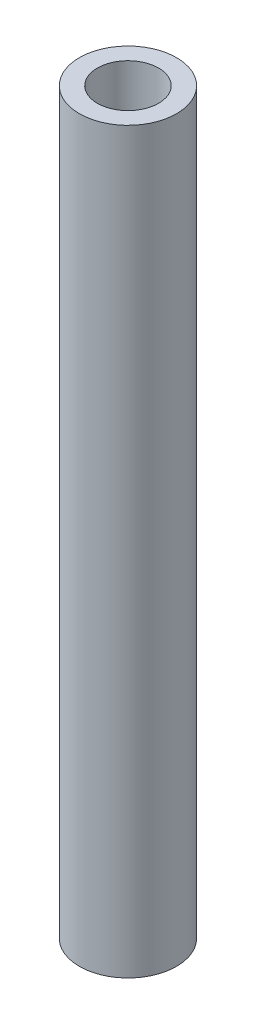
ISO-10303-21;
HEADER;
FILE_DESCRIPTION(('STEP AP214'),'2;1');
FILE_NAME('part.step','',(''),(''),'','','');
FILE_SCHEMA(('AUTOMOTIVE_DESIGN { 1 0 10303 214 1 1 1 1 }'));
ENDSEC;
DATA;
#1=APPLICATION_CONTEXT('core data for automotive mechanical design processes');
#2=APPLICATION_PROTOCOL_DEFINITION('international standard','automotive_design',2000,#1);
#3=PRODUCT_CONTEXT('',#1,'mechanical');
#4=PRODUCT('Part','Part','',(#3));
#5=PRODUCT_RELATED_PRODUCT_CATEGORY('part','',(#4));
#6=PRODUCT_DEFINITION_FORMATION('','',#4);
#7=PRODUCT_DEFINITION_CONTEXT('part definition',#1,'design');
#8=PRODUCT_DEFINITION('design','',#6,#7);
#9=PRODUCT_DEFINITION_SHAPE('','',#8);
#10=(LENGTH_UNIT() NAMED_UNIT(*) SI_UNIT(.MILLI.,.METRE.));
#11=(NAMED_UNIT(*) PLANE_ANGLE_UNIT() SI_UNIT($,.RADIAN.));
#12=(NAMED_UNIT(*) SI_UNIT($,.STERADIAN.) SOLID_ANGLE_UNIT());
#13=UNCERTAINTY_MEASURE_WITH_UNIT(LENGTH_MEASURE(1.E-05),#10,'distance_accuracy_value','');
#14=(GEOMETRIC_REPRESENTATION_CONTEXT(3) GLOBAL_UNCERTAINTY_ASSIGNED_CONTEXT((#13)) GLOBAL_UNIT_ASSIGNED_CONTEXT((#10,
#11,#12)) REPRESENTATION_CONTEXT('',''));
#15=CARTESIAN_POINT('',(0.,0.,0.));
#16=DIRECTION('',(0.,0.,1.));
#17=DIRECTION('',(1.,0.,0.));
#18=AXIS2_PLACEMENT_3D('',#15,#16,#17);
#19=CARTESIAN_POINT('',(0.,-48.26,0.));
#20=DIRECTION('',(0.,1.,0.));
#21=DIRECTION('',(0.,0.,1.));
#22=AXIS2_PLACEMENT_3D('',#19,#20,#21);
#23=CYLINDRICAL_SURFACE('',#22,3.175);
#24=CARTESIAN_POINT('',(0.,-48.26,0.));
#25=DIRECTION('',(0.,1.,0.));
#26=DIRECTION('',(0.,0.,1.));
#27=AXIS2_PLACEMENT_3D('',#24,#25,#26);
#28=CIRCLE('',#27,3.175);
#29=CARTESIAN_POINT('',(0.,-48.26,3.175));
#30=VERTEX_POINT('',#29);
#31=EDGE_CURVE('E10',#30,#30,#28,.T.);
#32=ORIENTED_EDGE('',*,*,#31,.T.);
#33=EDGE_LOOP('',(#32));
#34=FACE_BOUND('',#33,.T.);
#35=CARTESIAN_POINT('',(0.,0.,0.));
#36=DIRECTION('',(0.,1.,0.));
#37=DIRECTION('',(0.,0.,1.));
#38=AXIS2_PLACEMENT_3D('',#35,#36,#37);
#39=CIRCLE('',#38,3.175);
#40=CARTESIAN_POINT('',(0.,0.,3.175));
#41=VERTEX_POINT('',#40);
#42=EDGE_CURVE('E44',#41,#41,#39,.T.);
#43=ORIENTED_EDGE('',*,*,#42,.F.);
#44=EDGE_LOOP('',(#43));
#45=FACE_BOUND('',#44,.T.);
#46=ADVANCED_FACE('F41',(#34,#45),#23,.T.);
#47=CARTESIAN_POINT('',(0.,-48.26,0.));
#48=DIRECTION('',(0.,1.,0.));
#49=DIRECTION('',(0.,0.,1.));
#50=AXIS2_PLACEMENT_3D('',#47,#48,#49);
#51=PLANE('',#50);
#52=CARTESIAN_POINT('',(0.,-48.26,0.));
#53=DIRECTION('',(0.,1.,0.));
#54=DIRECTION('',(0.,0.,1.));
#55=AXIS2_PLACEMENT_3D('',#52,#53,#54);
#56=CIRCLE('',#55,2.);
#57=CARTESIAN_POINT('',(0.,-48.26,2.));
#58=VERTEX_POINT('',#57);
#59=EDGE_CURVE('E51',#58,#58,#56,.T.);
#60=ORIENTED_EDGE('',*,*,#59,.T.);
#61=EDGE_LOOP('',(#60));
#62=FACE_BOUND('',#61,.T.);
#63=ORIENTED_EDGE('',*,*,#31,.F.);
#64=EDGE_LOOP('',(#63));
#65=FACE_BOUND('',#64,.T.);
#66=ADVANCED_FACE('F59',(#62,#65),#51,.F.);
#67=CARTESIAN_POINT('',(0.,0.,0.));
#68=DIRECTION('',(0.,1.,0.));
#69=DIRECTION('',(0.,0.,1.));
#70=AXIS2_PLACEMENT_3D('',#67,#68,#69);
#71=PLANE('',#70);
#72=CARTESIAN_POINT('',(0.,0.,0.));
#73=DIRECTION('',(0.,1.,0.));
#74=DIRECTION('',(0.,0.,1.));
#75=AXIS2_PLACEMENT_3D('',#72,#73,#74);
#76=CIRCLE('',#75,2.);
#77=CARTESIAN_POINT('',(0.,0.,2.));
#78=VERTEX_POINT('',#77);
#79=EDGE_CURVE('E53',#78,#78,#76,.T.);
#80=ORIENTED_EDGE('',*,*,#79,.F.);
#81=EDGE_LOOP('',(#80));
#82=FACE_BOUND('',#81,.T.);
#83=ORIENTED_EDGE('',*,*,#42,.T.);
#84=EDGE_LOOP('',(#83));
#85=FACE_BOUND('',#84,.T.);
#86=ADVANCED_FACE('F65',(#82,#85),#71,.T.);
#87=CARTESIAN_POINT('',(0.,-48.26,0.));
#88=DIRECTION('',(0.,1.,0.));
#89=DIRECTION('',(0.,0.,1.));
#90=AXIS2_PLACEMENT_3D('',#87,#88,#89);
#91=CYLINDRICAL_SURFACE('',#90,2.);
#92=ORIENTED_EDGE('',*,*,#59,.F.);
#93=EDGE_LOOP('',(#92));
#94=FACE_BOUND('',#93,.T.);
#95=ORIENTED_EDGE('',*,*,#79,.T.);
#96=EDGE_LOOP('',(#95));
#97=FACE_BOUND('',#96,.T.);
#98=ADVANCED_FACE('F62',(#94,#97),#91,.F.);
#99=CLOSED_SHELL('',(#46,#66,#86,#98));
#100=MANIFOLD_SOLID_BREP('B2',#99);
#101=ADVANCED_BREP_SHAPE_REPRESENTATION('',(#18,#100),#14);
#102=SHAPE_DEFINITION_REPRESENTATION(#9,#101);
ENDSEC;
END-ISO-10303-21;
